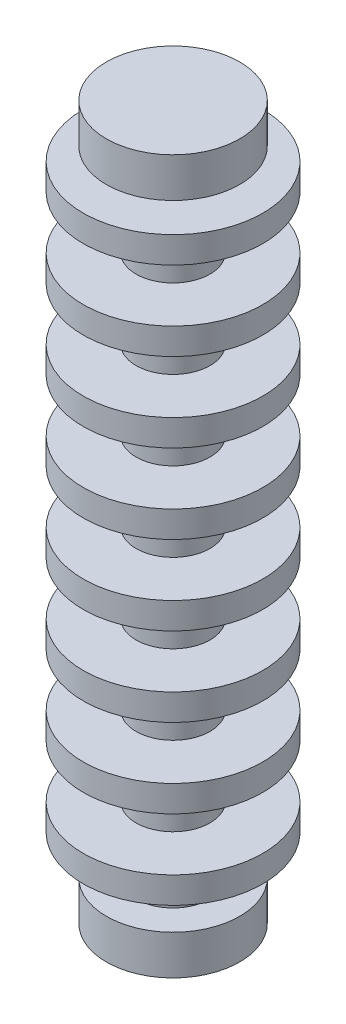
ISO-10303-21;
HEADER;
FILE_DESCRIPTION(('STEP AP214'),'2;1');
FILE_NAME('part.step','',(''),(''),'','','');
FILE_SCHEMA(('AUTOMOTIVE_DESIGN { 1 0 10303 214 1 1 1 1 }'));
ENDSEC;
DATA;
#1=APPLICATION_CONTEXT('core data for automotive mechanical design processes');
#2=APPLICATION_PROTOCOL_DEFINITION('international standard','automotive_design',2000,#1);
#3=PRODUCT_CONTEXT('',#1,'mechanical');
#4=PRODUCT('Part','Part','',(#3));
#5=PRODUCT_RELATED_PRODUCT_CATEGORY('part','',(#4));
#6=PRODUCT_DEFINITION_FORMATION('','',#4);
#7=PRODUCT_DEFINITION_CONTEXT('part definition',#1,'design');
#8=PRODUCT_DEFINITION('design','',#6,#7);
#9=PRODUCT_DEFINITION_SHAPE('','',#8);
#10=(LENGTH_UNIT() NAMED_UNIT(*) SI_UNIT(.MILLI.,.METRE.));
#11=(NAMED_UNIT(*) PLANE_ANGLE_UNIT() SI_UNIT($,.RADIAN.));
#12=(NAMED_UNIT(*) SI_UNIT($,.STERADIAN.) SOLID_ANGLE_UNIT());
#13=UNCERTAINTY_MEASURE_WITH_UNIT(LENGTH_MEASURE(1.E-05),#10,'distance_accuracy_value','');
#14=(GEOMETRIC_REPRESENTATION_CONTEXT(3) GLOBAL_UNCERTAINTY_ASSIGNED_CONTEXT((#13)) GLOBAL_UNIT_ASSIGNED_CONTEXT((#10,
#11,#12)) REPRESENTATION_CONTEXT('',''));
#15=CARTESIAN_POINT('',(0.,0.,0.));
#16=DIRECTION('',(0.,0.,1.));
#17=DIRECTION('',(1.,0.,0.));
#18=AXIS2_PLACEMENT_3D('',#15,#16,#17);
#19=CARTESIAN_POINT('',(5.04999999999947,27.,0.));
#20=DIRECTION('',(0.,-1.,0.));
#21=DIRECTION('',(1.,0.,0.));
#22=AXIS2_PLACEMENT_3D('',#19,#20,#21);
#23=PLANE('',#22);
#24=CARTESIAN_POINT('',(0.,27.,0.));
#25=DIRECTION('',(0.,1.,0.));
#26=DIRECTION('',(-1.,0.,0.));
#27=AXIS2_PLACEMENT_3D('',#24,#25,#26);
#28=CIRCLE('',#27,5.04999999999947);
#29=CARTESIAN_POINT('',(-5.04999999999947,27.,0.));
#30=VERTEX_POINT('',#29);
#31=EDGE_CURVE('E159',#30,#30,#28,.T.);
#32=ORIENTED_EDGE('',*,*,#31,.T.);
#33=EDGE_LOOP('',(#32));
#34=FACE_BOUND('',#33,.T.);
#35=ADVANCED_FACE('F41',(#34),#23,.F.);
#36=CARTESIAN_POINT('',(5.04999999999947,-27.,0.));
#37=DIRECTION('',(0.,1.,0.));
#38=DIRECTION('',(-1.,0.,0.));
#39=AXIS2_PLACEMENT_3D('',#36,#37,#38);
#40=PLANE('',#39);
#41=CARTESIAN_POINT('',(0.,-27.,0.));
#42=DIRECTION('',(0.,1.,0.));
#43=DIRECTION('',(-1.,0.,0.));
#44=AXIS2_PLACEMENT_3D('',#41,#42,#43);
#45=CIRCLE('',#44,5.04999999999947);
#46=CARTESIAN_POINT('',(-5.04999999999947,-27.,0.));
#47=VERTEX_POINT('',#46);
#48=EDGE_CURVE('E10',#47,#47,#45,.T.);
#49=ORIENTED_EDGE('',*,*,#48,.F.);
#50=EDGE_LOOP('',(#49));
#51=FACE_BOUND('',#50,.T.);
#52=ADVANCED_FACE('F381',(#51),#40,.F.);
#53=CARTESIAN_POINT('',(0.,27.,0.));
#54=DIRECTION('',(0.,1.,0.));
#55=DIRECTION('',(-1.,0.,0.));
#56=AXIS2_PLACEMENT_3D('',#53,#54,#55);
#57=CYLINDRICAL_SURFACE('',#56,5.04999999999947);
#58=CARTESIAN_POINT('',(0.,-24.,0.));
#59=DIRECTION('',(0.,1.,0.));
#60=DIRECTION('',(-1.,0.,0.));
#61=AXIS2_PLACEMENT_3D('',#58,#59,#60);
#62=CIRCLE('',#61,5.04999999999947);
#63=CARTESIAN_POINT('',(-5.04999999999947,-24.,0.));
#64=VERTEX_POINT('',#63);
#65=EDGE_CURVE('E47',#64,#64,#62,.T.);
#66=ORIENTED_EDGE('',*,*,#65,.F.);
#67=EDGE_LOOP('',(#66));
#68=FACE_BOUND('',#67,.T.);
#69=ORIENTED_EDGE('',*,*,#48,.T.);
#70=EDGE_LOOP('',(#69));
#71=FACE_BOUND('',#70,.T.);
#72=ADVANCED_FACE('F376',(#68,#71),#57,.T.);
#73=CARTESIAN_POINT('',(2.8,-24.,0.));
#74=DIRECTION('',(0.,-1.,0.));
#75=DIRECTION('',(1.,0.,0.));
#76=AXIS2_PLACEMENT_3D('',#73,#74,#75);
#77=PLANE('',#76);
#78=CARTESIAN_POINT('',(0.,-24.,0.));
#79=DIRECTION('',(0.,1.,0.));
#80=DIRECTION('',(-1.,0.,0.));
#81=AXIS2_PLACEMENT_3D('',#78,#79,#80);
#82=CIRCLE('',#81,2.8);
#83=CARTESIAN_POINT('',(-2.8,-24.,0.));
#84=VERTEX_POINT('',#83);
#85=EDGE_CURVE('E51',#84,#84,#82,.T.);
#86=ORIENTED_EDGE('',*,*,#85,.F.);
#87=EDGE_LOOP('',(#86));
#88=FACE_BOUND('',#87,.T.);
#89=ORIENTED_EDGE('',*,*,#65,.T.);
#90=EDGE_LOOP('',(#89));
#91=FACE_BOUND('',#90,.T.);
#92=ADVANCED_FACE('F371',(#88,#91),#77,.F.);
#93=CARTESIAN_POINT('',(0.,27.,0.));
#94=DIRECTION('',(0.,1.,0.));
#95=DIRECTION('',(-1.,0.,0.));
#96=AXIS2_PLACEMENT_3D('',#93,#94,#95);
#97=CYLINDRICAL_SURFACE('',#96,2.80000000000022);
#98=CARTESIAN_POINT('',(0.,-21.,0.));
#99=DIRECTION('',(0.,1.,0.));
#100=DIRECTION('',(-1.,0.,0.));
#101=AXIS2_PLACEMENT_3D('',#98,#99,#100);
#102=CIRCLE('',#101,2.80000000000043);
#103=CARTESIAN_POINT('',(-2.80000000000043,-21.,0.));
#104=VERTEX_POINT('',#103);
#105=EDGE_CURVE('E55',#104,#104,#102,.T.);
#106=ORIENTED_EDGE('',*,*,#105,.F.);
#107=EDGE_LOOP('',(#106));
#108=FACE_BOUND('',#107,.T.);
#109=ORIENTED_EDGE('',*,*,#85,.T.);
#110=EDGE_LOOP('',(#109));
#111=FACE_BOUND('',#110,.T.);
#112=ADVANCED_FACE('F365',(#108,#111),#97,.T.);
#113=CARTESIAN_POINT('',(6.80000000000044,-21.,0.));
#114=DIRECTION('',(0.,1.,0.));
#115=DIRECTION('',(-1.,0.,0.));
#116=AXIS2_PLACEMENT_3D('',#113,#114,#115);
#117=PLANE('',#116);
#118=CARTESIAN_POINT('',(0.,-21.,0.));
#119=DIRECTION('',(0.,1.,0.));
#120=DIRECTION('',(-1.,0.,0.));
#121=AXIS2_PLACEMENT_3D('',#118,#119,#120);
#122=CIRCLE('',#121,6.80000000000044);
#123=CARTESIAN_POINT('',(-6.80000000000044,-21.,0.));
#124=VERTEX_POINT('',#123);
#125=EDGE_CURVE('E60',#124,#124,#122,.T.);
#126=ORIENTED_EDGE('',*,*,#125,.F.);
#127=EDGE_LOOP('',(#126));
#128=FACE_BOUND('',#127,.T.);
#129=ORIENTED_EDGE('',*,*,#105,.T.);
#130=EDGE_LOOP('',(#129));
#131=FACE_BOUND('',#130,.T.);
#132=ADVANCED_FACE('F359',(#128,#131),#117,.F.);
#133=CARTESIAN_POINT('',(0.,27.,0.));
#134=DIRECTION('',(0.,1.,0.));
#135=DIRECTION('',(-1.,0.,0.));
#136=AXIS2_PLACEMENT_3D('',#133,#134,#135);
#137=CYLINDRICAL_SURFACE('',#136,6.80000000000044);
#138=CARTESIAN_POINT('',(0.,-19.,0.));
#139=DIRECTION('',(0.,1.,0.));
#140=DIRECTION('',(-1.,0.,0.));
#141=AXIS2_PLACEMENT_3D('',#138,#139,#140);
#142=CIRCLE('',#141,6.80000000000044);
#143=CARTESIAN_POINT('',(-6.80000000000043,-19.,0.));
#144=VERTEX_POINT('',#143);
#145=EDGE_CURVE('E63',#144,#144,#142,.T.);
#146=ORIENTED_EDGE('',*,*,#145,.F.);
#147=EDGE_LOOP('',(#146));
#148=FACE_BOUND('',#147,.T.);
#149=ORIENTED_EDGE('',*,*,#125,.T.);
#150=EDGE_LOOP('',(#149));
#151=FACE_BOUND('',#150,.T.);
#152=ADVANCED_FACE('F353',(#148,#151),#137,.T.);
#153=CARTESIAN_POINT('',(2.80000000000044,-19.,0.));
#154=DIRECTION('',(0.,-1.,0.));
#155=DIRECTION('',(1.,0.,0.));
#156=AXIS2_PLACEMENT_3D('',#153,#154,#155);
#157=PLANE('',#156);
#158=CARTESIAN_POINT('',(0.,-19.,0.));
#159=DIRECTION('',(0.,1.,0.));
#160=DIRECTION('',(-1.,0.,0.));
#161=AXIS2_PLACEMENT_3D('',#158,#159,#160);
#162=CIRCLE('',#161,2.80000000000043);
#163=CARTESIAN_POINT('',(-2.80000000000043,-19.,0.));
#164=VERTEX_POINT('',#163);
#165=EDGE_CURVE('E66',#164,#164,#162,.T.);
#166=ORIENTED_EDGE('',*,*,#165,.F.);
#167=EDGE_LOOP('',(#166));
#168=FACE_BOUND('',#167,.T.);
#169=ORIENTED_EDGE('',*,*,#145,.T.);
#170=EDGE_LOOP('',(#169));
#171=FACE_BOUND('',#170,.T.);
#172=ADVANCED_FACE('F347',(#168,#171),#157,.F.);
#173=CARTESIAN_POINT('',(0.,27.,0.));
#174=DIRECTION('',(0.,1.,0.));
#175=DIRECTION('',(-1.,0.,0.));
#176=AXIS2_PLACEMENT_3D('',#173,#174,#175);
#177=CYLINDRICAL_SURFACE('',#176,2.8000000000004);
#178=CARTESIAN_POINT('',(0.,-15.,0.));
#179=DIRECTION('',(0.,1.,0.));
#180=DIRECTION('',(-1.,0.,0.));
#181=AXIS2_PLACEMENT_3D('',#178,#179,#180);
#182=CIRCLE('',#181,2.80000000000037);
#183=CARTESIAN_POINT('',(-2.80000000000037,-15.,0.));
#184=VERTEX_POINT('',#183);
#185=EDGE_CURVE('E69',#184,#184,#182,.T.);
#186=ORIENTED_EDGE('',*,*,#185,.F.);
#187=EDGE_LOOP('',(#186));
#188=FACE_BOUND('',#187,.T.);
#189=ORIENTED_EDGE('',*,*,#165,.T.);
#190=EDGE_LOOP('',(#189));
#191=FACE_BOUND('',#190,.T.);
#192=ADVANCED_FACE('F341',(#188,#191),#177,.T.);
#193=CARTESIAN_POINT('',(6.80000000000038,-15.,0.));
#194=DIRECTION('',(0.,1.,0.));
#195=DIRECTION('',(-1.,0.,0.));
#196=AXIS2_PLACEMENT_3D('',#193,#194,#195);
#197=PLANE('',#196);
#198=CARTESIAN_POINT('',(0.,-15.,0.));
#199=DIRECTION('',(0.,1.,0.));
#200=DIRECTION('',(-1.,0.,0.));
#201=AXIS2_PLACEMENT_3D('',#198,#199,#200);
#202=CIRCLE('',#201,6.80000000000038);
#203=CARTESIAN_POINT('',(-6.80000000000037,-15.,0.));
#204=VERTEX_POINT('',#203);
#205=EDGE_CURVE('E72',#204,#204,#202,.T.);
#206=ORIENTED_EDGE('',*,*,#205,.F.);
#207=EDGE_LOOP('',(#206));
#208=FACE_BOUND('',#207,.T.);
#209=ORIENTED_EDGE('',*,*,#185,.T.);
#210=EDGE_LOOP('',(#209));
#211=FACE_BOUND('',#210,.T.);
#212=ADVANCED_FACE('F335',(#208,#211),#197,.F.);
#213=CARTESIAN_POINT('',(0.,27.,0.));
#214=DIRECTION('',(0.,1.,0.));
#215=DIRECTION('',(-1.,0.,0.));
#216=AXIS2_PLACEMENT_3D('',#213,#214,#215);
#217=CYLINDRICAL_SURFACE('',#216,6.80000000000038);
#218=CARTESIAN_POINT('',(0.,-13.,0.));
#219=DIRECTION('',(0.,1.,0.));
#220=DIRECTION('',(-1.,0.,0.));
#221=AXIS2_PLACEMENT_3D('',#218,#219,#220);
#222=CIRCLE('',#221,6.80000000000037);
#223=CARTESIAN_POINT('',(-6.80000000000037,-13.,0.));
#224=VERTEX_POINT('',#223);
#225=EDGE_CURVE('E75',#224,#224,#222,.T.);
#226=ORIENTED_EDGE('',*,*,#225,.F.);
#227=EDGE_LOOP('',(#226));
#228=FACE_BOUND('',#227,.T.);
#229=ORIENTED_EDGE('',*,*,#205,.T.);
#230=EDGE_LOOP('',(#229));
#231=FACE_BOUND('',#230,.T.);
#232=ADVANCED_FACE('F329',(#228,#231),#217,.T.);
#233=CARTESIAN_POINT('',(2.80000000000037,-13.,0.));
#234=DIRECTION('',(0.,-1.,0.));
#235=DIRECTION('',(1.,0.,0.));
#236=AXIS2_PLACEMENT_3D('',#233,#234,#235);
#237=PLANE('',#236);
#238=CARTESIAN_POINT('',(0.,-13.,0.));
#239=DIRECTION('',(0.,1.,0.));
#240=DIRECTION('',(-1.,0.,0.));
#241=AXIS2_PLACEMENT_3D('',#238,#239,#240);
#242=CIRCLE('',#241,2.80000000000037);
#243=CARTESIAN_POINT('',(-2.80000000000037,-13.,0.));
#244=VERTEX_POINT('',#243);
#245=EDGE_CURVE('E78',#244,#244,#242,.T.);
#246=ORIENTED_EDGE('',*,*,#245,.F.);
#247=EDGE_LOOP('',(#246));
#248=FACE_BOUND('',#247,.T.);
#249=ORIENTED_EDGE('',*,*,#225,.T.);
#250=EDGE_LOOP('',(#249));
#251=FACE_BOUND('',#250,.T.);
#252=ADVANCED_FACE('F323',(#248,#251),#237,.F.);
#253=CARTESIAN_POINT('',(0.,27.,0.));
#254=DIRECTION('',(0.,1.,0.));
#255=DIRECTION('',(-1.,0.,0.));
#256=AXIS2_PLACEMENT_3D('',#253,#254,#255);
#257=CYLINDRICAL_SURFACE('',#256,2.80000000000034);
#258=CARTESIAN_POINT('',(0.,-9.,0.));
#259=DIRECTION('',(0.,1.,0.));
#260=DIRECTION('',(-1.,0.,0.));
#261=AXIS2_PLACEMENT_3D('',#258,#259,#260);
#262=CIRCLE('',#261,2.80000000000031);
#263=CARTESIAN_POINT('',(-2.80000000000031,-9.,0.));
#264=VERTEX_POINT('',#263);
#265=EDGE_CURVE('E81',#264,#264,#262,.T.);
#266=ORIENTED_EDGE('',*,*,#265,.F.);
#267=EDGE_LOOP('',(#266));
#268=FACE_BOUND('',#267,.T.);
#269=ORIENTED_EDGE('',*,*,#245,.T.);
#270=EDGE_LOOP('',(#269));
#271=FACE_BOUND('',#270,.T.);
#272=ADVANCED_FACE('F317',(#268,#271),#257,.T.);
#273=CARTESIAN_POINT('',(6.80000000000032,-9.,0.));
#274=DIRECTION('',(0.,1.,0.));
#275=DIRECTION('',(-1.,0.,0.));
#276=AXIS2_PLACEMENT_3D('',#273,#274,#275);
#277=PLANE('',#276);
#278=CARTESIAN_POINT('',(0.,-9.,0.));
#279=DIRECTION('',(0.,1.,0.));
#280=DIRECTION('',(-1.,0.,0.));
#281=AXIS2_PLACEMENT_3D('',#278,#279,#280);
#282=CIRCLE('',#281,6.80000000000031);
#283=CARTESIAN_POINT('',(-6.80000000000031,-9.,0.));
#284=VERTEX_POINT('',#283);
#285=EDGE_CURVE('E84',#284,#284,#282,.T.);
#286=ORIENTED_EDGE('',*,*,#285,.F.);
#287=EDGE_LOOP('',(#286));
#288=FACE_BOUND('',#287,.T.);
#289=ORIENTED_EDGE('',*,*,#265,.T.);
#290=EDGE_LOOP('',(#289));
#291=FACE_BOUND('',#290,.T.);
#292=ADVANCED_FACE('F311',(#288,#291),#277,.F.);
#293=CARTESIAN_POINT('',(0.,27.,0.));
#294=DIRECTION('',(0.,1.,0.));
#295=DIRECTION('',(-1.,0.,0.));
#296=AXIS2_PLACEMENT_3D('',#293,#294,#295);
#297=CYLINDRICAL_SURFACE('',#296,6.80000000000031);
#298=CARTESIAN_POINT('',(0.,-7.,0.));
#299=DIRECTION('',(0.,1.,0.));
#300=DIRECTION('',(-1.,0.,0.));
#301=AXIS2_PLACEMENT_3D('',#298,#299,#300);
#302=CIRCLE('',#301,6.80000000000031);
#303=CARTESIAN_POINT('',(-6.80000000000031,-7.,0.));
#304=VERTEX_POINT('',#303);
#305=EDGE_CURVE('E87',#304,#304,#302,.T.);
#306=ORIENTED_EDGE('',*,*,#305,.F.);
#307=EDGE_LOOP('',(#306));
#308=FACE_BOUND('',#307,.T.);
#309=ORIENTED_EDGE('',*,*,#285,.T.);
#310=EDGE_LOOP('',(#309));
#311=FACE_BOUND('',#310,.T.);
#312=ADVANCED_FACE('F305',(#308,#311),#297,.T.);
#313=CARTESIAN_POINT('',(2.80000000000031,-7.,0.));
#314=DIRECTION('',(0.,-1.,0.));
#315=DIRECTION('',(1.,0.,0.));
#316=AXIS2_PLACEMENT_3D('',#313,#314,#315);
#317=PLANE('',#316);
#318=CARTESIAN_POINT('',(0.,-7.,0.));
#319=DIRECTION('',(0.,1.,0.));
#320=DIRECTION('',(-1.,0.,0.));
#321=AXIS2_PLACEMENT_3D('',#318,#319,#320);
#322=CIRCLE('',#321,2.80000000000031);
#323=CARTESIAN_POINT('',(-2.80000000000031,-7.,0.));
#324=VERTEX_POINT('',#323);
#325=EDGE_CURVE('E90',#324,#324,#322,.T.);
#326=ORIENTED_EDGE('',*,*,#325,.F.);
#327=EDGE_LOOP('',(#326));
#328=FACE_BOUND('',#327,.T.);
#329=ORIENTED_EDGE('',*,*,#305,.T.);
#330=EDGE_LOOP('',(#329));
#331=FACE_BOUND('',#330,.T.);
#332=ADVANCED_FACE('F299',(#328,#331),#317,.F.);
#333=CARTESIAN_POINT('',(0.,27.,0.));
#334=DIRECTION('',(0.,1.,0.));
#335=DIRECTION('',(-1.,0.,0.));
#336=AXIS2_PLACEMENT_3D('',#333,#334,#335);
#337=CYLINDRICAL_SURFACE('',#336,2.80000000000028);
#338=CARTESIAN_POINT('',(0.,-3.,0.));
#339=DIRECTION('',(0.,1.,0.));
#340=DIRECTION('',(-1.,0.,0.));
#341=AXIS2_PLACEMENT_3D('',#338,#339,#340);
#342=CIRCLE('',#341,2.80000000000025);
#343=CARTESIAN_POINT('',(-2.80000000000025,-3.,0.));
#344=VERTEX_POINT('',#343);
#345=EDGE_CURVE('E93',#344,#344,#342,.T.);
#346=ORIENTED_EDGE('',*,*,#345,.F.);
#347=EDGE_LOOP('',(#346));
#348=FACE_BOUND('',#347,.T.);
#349=ORIENTED_EDGE('',*,*,#325,.T.);
#350=EDGE_LOOP('',(#349));
#351=FACE_BOUND('',#350,.T.);
#352=ADVANCED_FACE('F293',(#348,#351),#337,.T.);
#353=CARTESIAN_POINT('',(6.80000000000025,-3.,0.));
#354=DIRECTION('',(0.,1.,0.));
#355=DIRECTION('',(-1.,0.,0.));
#356=AXIS2_PLACEMENT_3D('',#353,#354,#355);
#357=PLANE('',#356);
#358=CARTESIAN_POINT('',(0.,-3.,0.));
#359=DIRECTION('',(0.,1.,0.));
#360=DIRECTION('',(-1.,0.,0.));
#361=AXIS2_PLACEMENT_3D('',#358,#359,#360);
#362=CIRCLE('',#361,6.80000000000025);
#363=CARTESIAN_POINT('',(-6.80000000000025,-3.,0.));
#364=VERTEX_POINT('',#363);
#365=EDGE_CURVE('E96',#364,#364,#362,.T.);
#366=ORIENTED_EDGE('',*,*,#365,.F.);
#367=EDGE_LOOP('',(#366));
#368=FACE_BOUND('',#367,.T.);
#369=ORIENTED_EDGE('',*,*,#345,.T.);
#370=EDGE_LOOP('',(#369));
#371=FACE_BOUND('',#370,.T.);
#372=ADVANCED_FACE('F287',(#368,#371),#357,.F.);
#373=CARTESIAN_POINT('',(0.,27.,0.));
#374=DIRECTION('',(0.,1.,0.));
#375=DIRECTION('',(-1.,0.,0.));
#376=AXIS2_PLACEMENT_3D('',#373,#374,#375);
#377=CYLINDRICAL_SURFACE('',#376,6.80000000000025);
#378=CARTESIAN_POINT('',(0.,-1.,0.));
#379=DIRECTION('',(0.,1.,0.));
#380=DIRECTION('',(-1.,0.,0.));
#381=AXIS2_PLACEMENT_3D('',#378,#379,#380);
#382=CIRCLE('',#381,6.80000000000025);
#383=CARTESIAN_POINT('',(-6.80000000000025,-1.,0.));
#384=VERTEX_POINT('',#383);
#385=EDGE_CURVE('E99',#384,#384,#382,.T.);
#386=ORIENTED_EDGE('',*,*,#385,.F.);
#387=EDGE_LOOP('',(#386));
#388=FACE_BOUND('',#387,.T.);
#389=ORIENTED_EDGE('',*,*,#365,.T.);
#390=EDGE_LOOP('',(#389));
#391=FACE_BOUND('',#390,.T.);
#392=ADVANCED_FACE('F281',(#388,#391),#377,.T.);
#393=CARTESIAN_POINT('',(2.80000000000025,-1.,0.));
#394=DIRECTION('',(0.,-1.,0.));
#395=DIRECTION('',(1.,0.,0.));
#396=AXIS2_PLACEMENT_3D('',#393,#394,#395);
#397=PLANE('',#396);
#398=CARTESIAN_POINT('',(0.,-1.,0.));
#399=DIRECTION('',(0.,1.,0.));
#400=DIRECTION('',(-1.,0.,0.));
#401=AXIS2_PLACEMENT_3D('',#398,#399,#400);
#402=CIRCLE('',#401,2.80000000000025);
#403=CARTESIAN_POINT('',(-2.80000000000025,-1.,0.));
#404=VERTEX_POINT('',#403);
#405=EDGE_CURVE('E102',#404,#404,#402,.T.);
#406=ORIENTED_EDGE('',*,*,#405,.F.);
#407=EDGE_LOOP('',(#406));
#408=FACE_BOUND('',#407,.T.);
#409=ORIENTED_EDGE('',*,*,#385,.T.);
#410=EDGE_LOOP('',(#409));
#411=FACE_BOUND('',#410,.T.);
#412=ADVANCED_FACE('F275',(#408,#411),#397,.F.);
#413=CARTESIAN_POINT('',(0.,27.,0.));
#414=DIRECTION('',(0.,1.,0.));
#415=DIRECTION('',(-1.,0.,0.));
#416=AXIS2_PLACEMENT_3D('',#413,#414,#415);
#417=CYLINDRICAL_SURFACE('',#416,2.80000000000022);
#418=CARTESIAN_POINT('',(0.,3.,0.));
#419=DIRECTION('',(0.,1.,0.));
#420=DIRECTION('',(-1.,0.,0.));
#421=AXIS2_PLACEMENT_3D('',#418,#419,#420);
#422=CIRCLE('',#421,2.80000000000019);
#423=CARTESIAN_POINT('',(-2.80000000000018,3.,0.));
#424=VERTEX_POINT('',#423);
#425=EDGE_CURVE('E105',#424,#424,#422,.T.);
#426=ORIENTED_EDGE('',*,*,#425,.F.);
#427=EDGE_LOOP('',(#426));
#428=FACE_BOUND('',#427,.T.);
#429=ORIENTED_EDGE('',*,*,#405,.T.);
#430=EDGE_LOOP('',(#429));
#431=FACE_BOUND('',#430,.T.);
#432=ADVANCED_FACE('F269',(#428,#431),#417,.T.);
#433=CARTESIAN_POINT('',(6.80000000000019,3.,0.));
#434=DIRECTION('',(0.,1.,0.));
#435=DIRECTION('',(-1.,0.,0.));
#436=AXIS2_PLACEMENT_3D('',#433,#434,#435);
#437=PLANE('',#436);
#438=CARTESIAN_POINT('',(0.,3.,0.));
#439=DIRECTION('',(0.,1.,0.));
#440=DIRECTION('',(-1.,0.,0.));
#441=AXIS2_PLACEMENT_3D('',#438,#439,#440);
#442=CIRCLE('',#441,6.80000000000019);
#443=CARTESIAN_POINT('',(-6.80000000000019,3.,0.));
#444=VERTEX_POINT('',#443);
#445=EDGE_CURVE('E108',#444,#444,#442,.T.);
#446=ORIENTED_EDGE('',*,*,#445,.F.);
#447=EDGE_LOOP('',(#446));
#448=FACE_BOUND('',#447,.T.);
#449=ORIENTED_EDGE('',*,*,#425,.T.);
#450=EDGE_LOOP('',(#449));
#451=FACE_BOUND('',#450,.T.);
#452=ADVANCED_FACE('F263',(#448,#451),#437,.F.);
#453=CARTESIAN_POINT('',(0.,27.,0.));
#454=DIRECTION('',(0.,1.,0.));
#455=DIRECTION('',(-1.,0.,0.));
#456=AXIS2_PLACEMENT_3D('',#453,#454,#455);
#457=CYLINDRICAL_SURFACE('',#456,6.80000000000019);
#458=CARTESIAN_POINT('',(0.,5.,0.));
#459=DIRECTION('',(0.,1.,0.));
#460=DIRECTION('',(-1.,0.,0.));
#461=AXIS2_PLACEMENT_3D('',#458,#459,#460);
#462=CIRCLE('',#461,6.80000000000019);
#463=CARTESIAN_POINT('',(-6.80000000000019,5.,0.));
#464=VERTEX_POINT('',#463);
#465=EDGE_CURVE('E111',#464,#464,#462,.T.);
#466=ORIENTED_EDGE('',*,*,#465,.F.);
#467=EDGE_LOOP('',(#466));
#468=FACE_BOUND('',#467,.T.);
#469=ORIENTED_EDGE('',*,*,#445,.T.);
#470=EDGE_LOOP('',(#469));
#471=FACE_BOUND('',#470,.T.);
#472=ADVANCED_FACE('F257',(#468,#471),#457,.T.);
#473=CARTESIAN_POINT('',(2.80000000000019,5.,0.));
#474=DIRECTION('',(0.,-1.,0.));
#475=DIRECTION('',(1.,0.,0.));
#476=AXIS2_PLACEMENT_3D('',#473,#474,#475);
#477=PLANE('',#476);
#478=CARTESIAN_POINT('',(0.,5.,0.));
#479=DIRECTION('',(0.,1.,0.));
#480=DIRECTION('',(-1.,0.,0.));
#481=AXIS2_PLACEMENT_3D('',#478,#479,#480);
#482=CIRCLE('',#481,2.80000000000019);
#483=CARTESIAN_POINT('',(-2.80000000000018,5.,0.));
#484=VERTEX_POINT('',#483);
#485=EDGE_CURVE('E114',#484,#484,#482,.T.);
#486=ORIENTED_EDGE('',*,*,#485,.F.);
#487=EDGE_LOOP('',(#486));
#488=FACE_BOUND('',#487,.T.);
#489=ORIENTED_EDGE('',*,*,#465,.T.);
#490=EDGE_LOOP('',(#489));
#491=FACE_BOUND('',#490,.T.);
#492=ADVANCED_FACE('F251',(#488,#491),#477,.F.);
#493=CARTESIAN_POINT('',(0.,27.,0.));
#494=DIRECTION('',(0.,1.,0.));
#495=DIRECTION('',(-1.,0.,0.));
#496=AXIS2_PLACEMENT_3D('',#493,#494,#495);
#497=CYLINDRICAL_SURFACE('',#496,2.80000000000015);
#498=CARTESIAN_POINT('',(0.,8.99999999999999,0.));
#499=DIRECTION('',(0.,1.,0.));
#500=DIRECTION('',(-1.,0.,0.));
#501=AXIS2_PLACEMENT_3D('',#498,#499,#500);
#502=CIRCLE('',#501,2.80000000000012);
#503=CARTESIAN_POINT('',(-2.80000000000012,8.99999999999999,0.));
#504=VERTEX_POINT('',#503);
#505=EDGE_CURVE('E117',#504,#504,#502,.T.);
#506=ORIENTED_EDGE('',*,*,#505,.F.);
#507=EDGE_LOOP('',(#506));
#508=FACE_BOUND('',#507,.T.);
#509=ORIENTED_EDGE('',*,*,#485,.T.);
#510=EDGE_LOOP('',(#509));
#511=FACE_BOUND('',#510,.T.);
#512=ADVANCED_FACE('F245',(#508,#511),#497,.T.);
#513=CARTESIAN_POINT('',(6.80000000000013,9.,0.));
#514=DIRECTION('',(0.,1.,0.));
#515=DIRECTION('',(-1.,0.,0.));
#516=AXIS2_PLACEMENT_3D('',#513,#514,#515);
#517=PLANE('',#516);
#518=CARTESIAN_POINT('',(0.,9.,0.));
#519=DIRECTION('',(0.,1.,0.));
#520=DIRECTION('',(-1.,0.,0.));
#521=AXIS2_PLACEMENT_3D('',#518,#519,#520);
#522=CIRCLE('',#521,6.80000000000013);
#523=CARTESIAN_POINT('',(-6.80000000000013,9.,0.));
#524=VERTEX_POINT('',#523);
#525=EDGE_CURVE('E120',#524,#524,#522,.T.);
#526=ORIENTED_EDGE('',*,*,#525,.F.);
#527=EDGE_LOOP('',(#526));
#528=FACE_BOUND('',#527,.T.);
#529=ORIENTED_EDGE('',*,*,#505,.T.);
#530=EDGE_LOOP('',(#529));
#531=FACE_BOUND('',#530,.T.);
#532=ADVANCED_FACE('F239',(#528,#531),#517,.F.);
#533=CARTESIAN_POINT('',(0.,27.,0.));
#534=DIRECTION('',(0.,1.,0.));
#535=DIRECTION('',(-1.,0.,0.));
#536=AXIS2_PLACEMENT_3D('',#533,#534,#535);
#537=CYLINDRICAL_SURFACE('',#536,6.80000000000013);
#538=CARTESIAN_POINT('',(0.,11.,0.));
#539=DIRECTION('',(0.,1.,0.));
#540=DIRECTION('',(-1.,0.,0.));
#541=AXIS2_PLACEMENT_3D('',#538,#539,#540);
#542=CIRCLE('',#541,6.80000000000013);
#543=CARTESIAN_POINT('',(-6.80000000000013,11.,0.));
#544=VERTEX_POINT('',#543);
#545=EDGE_CURVE('E123',#544,#544,#542,.T.);
#546=ORIENTED_EDGE('',*,*,#545,.F.);
#547=EDGE_LOOP('',(#546));
#548=FACE_BOUND('',#547,.T.);
#549=ORIENTED_EDGE('',*,*,#525,.T.);
#550=EDGE_LOOP('',(#549));
#551=FACE_BOUND('',#550,.T.);
#552=ADVANCED_FACE('F233',(#548,#551),#537,.T.);
#553=CARTESIAN_POINT('',(2.80000000000012,11.,0.));
#554=DIRECTION('',(0.,-1.,0.));
#555=DIRECTION('',(1.,0.,0.));
#556=AXIS2_PLACEMENT_3D('',#553,#554,#555);
#557=PLANE('',#556);
#558=CARTESIAN_POINT('',(0.,11.,0.));
#559=DIRECTION('',(0.,1.,0.));
#560=DIRECTION('',(-1.,0.,0.));
#561=AXIS2_PLACEMENT_3D('',#558,#559,#560);
#562=CIRCLE('',#561,2.80000000000012);
#563=CARTESIAN_POINT('',(-2.80000000000012,11.,0.));
#564=VERTEX_POINT('',#563);
#565=EDGE_CURVE('E126',#564,#564,#562,.T.);
#566=ORIENTED_EDGE('',*,*,#565,.F.);
#567=EDGE_LOOP('',(#566));
#568=FACE_BOUND('',#567,.T.);
#569=ORIENTED_EDGE('',*,*,#545,.T.);
#570=EDGE_LOOP('',(#569));
#571=FACE_BOUND('',#570,.T.);
#572=ADVANCED_FACE('F227',(#568,#571),#557,.F.);
#573=CARTESIAN_POINT('',(0.,27.,0.));
#574=DIRECTION('',(0.,1.,0.));
#575=DIRECTION('',(-1.,0.,0.));
#576=AXIS2_PLACEMENT_3D('',#573,#574,#575);
#577=CYLINDRICAL_SURFACE('',#576,2.80000000000009);
#578=CARTESIAN_POINT('',(0.,15.,0.));
#579=DIRECTION('',(0.,1.,0.));
#580=DIRECTION('',(-1.,0.,0.));
#581=AXIS2_PLACEMENT_3D('',#578,#579,#580);
#582=CIRCLE('',#581,2.80000000000006);
#583=CARTESIAN_POINT('',(-2.80000000000006,15.,0.));
#584=VERTEX_POINT('',#583);
#585=EDGE_CURVE('E129',#584,#584,#582,.T.);
#586=ORIENTED_EDGE('',*,*,#585,.F.);
#587=EDGE_LOOP('',(#586));
#588=FACE_BOUND('',#587,.T.);
#589=ORIENTED_EDGE('',*,*,#565,.T.);
#590=EDGE_LOOP('',(#589));
#591=FACE_BOUND('',#590,.T.);
#592=ADVANCED_FACE('F221',(#588,#591),#577,.T.);
#593=CARTESIAN_POINT('',(6.80000000000007,15.,0.));
#594=DIRECTION('',(0.,1.,0.));
#595=DIRECTION('',(-1.,0.,0.));
#596=AXIS2_PLACEMENT_3D('',#593,#594,#595);
#597=PLANE('',#596);
#598=CARTESIAN_POINT('',(0.,15.,0.));
#599=DIRECTION('',(0.,1.,0.));
#600=DIRECTION('',(-1.,0.,0.));
#601=AXIS2_PLACEMENT_3D('',#598,#599,#600);
#602=CIRCLE('',#601,6.80000000000007);
#603=CARTESIAN_POINT('',(-6.80000000000006,15.,0.));
#604=VERTEX_POINT('',#603);
#605=EDGE_CURVE('E132',#604,#604,#602,.T.);
#606=ORIENTED_EDGE('',*,*,#605,.F.);
#607=EDGE_LOOP('',(#606));
#608=FACE_BOUND('',#607,.T.);
#609=ORIENTED_EDGE('',*,*,#585,.T.);
#610=EDGE_LOOP('',(#609));
#611=FACE_BOUND('',#610,.T.);
#612=ADVANCED_FACE('F215',(#608,#611),#597,.F.);
#613=CARTESIAN_POINT('',(0.,27.,0.));
#614=DIRECTION('',(0.,1.,0.));
#615=DIRECTION('',(-1.,0.,0.));
#616=AXIS2_PLACEMENT_3D('',#613,#614,#615);
#617=CYLINDRICAL_SURFACE('',#616,6.80000000000006);
#618=CARTESIAN_POINT('',(0.,17.,0.));
#619=DIRECTION('',(0.,1.,0.));
#620=DIRECTION('',(-1.,0.,0.));
#621=AXIS2_PLACEMENT_3D('',#618,#619,#620);
#622=CIRCLE('',#621,6.80000000000006);
#623=CARTESIAN_POINT('',(-6.80000000000006,17.,0.));
#624=VERTEX_POINT('',#623);
#625=EDGE_CURVE('E135',#624,#624,#622,.T.);
#626=ORIENTED_EDGE('',*,*,#625,.F.);
#627=EDGE_LOOP('',(#626));
#628=FACE_BOUND('',#627,.T.);
#629=ORIENTED_EDGE('',*,*,#605,.T.);
#630=EDGE_LOOP('',(#629));
#631=FACE_BOUND('',#630,.T.);
#632=ADVANCED_FACE('F209',(#628,#631),#617,.T.);
#633=CARTESIAN_POINT('',(2.80000000000006,17.,0.));
#634=DIRECTION('',(0.,-1.,0.));
#635=DIRECTION('',(1.,0.,0.));
#636=AXIS2_PLACEMENT_3D('',#633,#634,#635);
#637=PLANE('',#636);
#638=CARTESIAN_POINT('',(0.,17.,0.));
#639=DIRECTION('',(0.,1.,0.));
#640=DIRECTION('',(-1.,0.,0.));
#641=AXIS2_PLACEMENT_3D('',#638,#639,#640);
#642=CIRCLE('',#641,2.80000000000006);
#643=CARTESIAN_POINT('',(-2.80000000000006,17.,0.));
#644=VERTEX_POINT('',#643);
#645=EDGE_CURVE('E138',#644,#644,#642,.T.);
#646=ORIENTED_EDGE('',*,*,#645,.F.);
#647=EDGE_LOOP('',(#646));
#648=FACE_BOUND('',#647,.T.);
#649=ORIENTED_EDGE('',*,*,#625,.T.);
#650=EDGE_LOOP('',(#649));
#651=FACE_BOUND('',#650,.T.);
#652=ADVANCED_FACE('F203',(#648,#651),#637,.F.);
#653=CARTESIAN_POINT('',(0.,27.,0.));
#654=DIRECTION('',(0.,1.,0.));
#655=DIRECTION('',(-1.,0.,0.));
#656=AXIS2_PLACEMENT_3D('',#653,#654,#655);
#657=CYLINDRICAL_SURFACE('',#656,2.79999999999978);
#658=CARTESIAN_POINT('',(0.,21.,0.));
#659=DIRECTION('',(0.,1.,0.));
#660=DIRECTION('',(-1.,0.,0.));
#661=AXIS2_PLACEMENT_3D('',#658,#659,#660);
#662=CIRCLE('',#661,2.8);
#663=CARTESIAN_POINT('',(-2.8,21.,0.));
#664=VERTEX_POINT('',#663);
#665=EDGE_CURVE('E141',#664,#664,#662,.T.);
#666=ORIENTED_EDGE('',*,*,#665,.F.);
#667=EDGE_LOOP('',(#666));
#668=FACE_BOUND('',#667,.T.);
#669=ORIENTED_EDGE('',*,*,#645,.T.);
#670=EDGE_LOOP('',(#669));
#671=FACE_BOUND('',#670,.T.);
#672=ADVANCED_FACE('F197',(#668,#671),#657,.T.);
#673=CARTESIAN_POINT('',(6.8,21.,0.));
#674=DIRECTION('',(0.,1.,0.));
#675=DIRECTION('',(-1.,0.,0.));
#676=AXIS2_PLACEMENT_3D('',#673,#674,#675);
#677=PLANE('',#676);
#678=CARTESIAN_POINT('',(0.,21.,0.));
#679=DIRECTION('',(0.,1.,0.));
#680=DIRECTION('',(-1.,0.,0.));
#681=AXIS2_PLACEMENT_3D('',#678,#679,#680);
#682=CIRCLE('',#681,6.8);
#683=CARTESIAN_POINT('',(-6.8,21.,0.));
#684=VERTEX_POINT('',#683);
#685=EDGE_CURVE('E144',#684,#684,#682,.T.);
#686=ORIENTED_EDGE('',*,*,#685,.F.);
#687=EDGE_LOOP('',(#686));
#688=FACE_BOUND('',#687,.T.);
#689=ORIENTED_EDGE('',*,*,#665,.T.);
#690=EDGE_LOOP('',(#689));
#691=FACE_BOUND('',#690,.T.);
#692=ADVANCED_FACE('F191',(#688,#691),#677,.F.);
#693=CARTESIAN_POINT('',(0.,27.,0.));
#694=DIRECTION('',(0.,1.,0.));
#695=DIRECTION('',(-1.,0.,0.));
#696=AXIS2_PLACEMENT_3D('',#693,#694,#695);
#697=CYLINDRICAL_SURFACE('',#696,6.8);
#698=CARTESIAN_POINT('',(0.,23.,0.));
#699=DIRECTION('',(0.,1.,0.));
#700=DIRECTION('',(-1.,0.,0.));
#701=AXIS2_PLACEMENT_3D('',#698,#699,#700);
#702=CIRCLE('',#701,6.8);
#703=CARTESIAN_POINT('',(-6.8,23.,0.));
#704=VERTEX_POINT('',#703);
#705=EDGE_CURVE('E147',#704,#704,#702,.T.);
#706=ORIENTED_EDGE('',*,*,#705,.F.);
#707=EDGE_LOOP('',(#706));
#708=FACE_BOUND('',#707,.T.);
#709=ORIENTED_EDGE('',*,*,#685,.T.);
#710=EDGE_LOOP('',(#709));
#711=FACE_BOUND('',#710,.T.);
#712=ADVANCED_FACE('F185',(#708,#711),#697,.T.);
#713=CARTESIAN_POINT('',(2.8,23.,0.));
#714=DIRECTION('',(0.,-1.,0.));
#715=DIRECTION('',(1.,0.,0.));
#716=AXIS2_PLACEMENT_3D('',#713,#714,#715);
#717=PLANE('',#716);
#718=CARTESIAN_POINT('',(0.,23.,0.));
#719=DIRECTION('',(0.,1.,0.));
#720=DIRECTION('',(-1.,0.,0.));
#721=AXIS2_PLACEMENT_3D('',#718,#719,#720);
#722=CIRCLE('',#721,2.8);
#723=CARTESIAN_POINT('',(-2.8,23.,0.));
#724=VERTEX_POINT('',#723);
#725=EDGE_CURVE('E150',#724,#724,#722,.T.);
#726=ORIENTED_EDGE('',*,*,#725,.F.);
#727=EDGE_LOOP('',(#726));
#728=FACE_BOUND('',#727,.T.);
#729=ORIENTED_EDGE('',*,*,#705,.T.);
#730=EDGE_LOOP('',(#729));
#731=FACE_BOUND('',#730,.T.);
#732=ADVANCED_FACE('F179',(#728,#731),#717,.F.);
#733=CARTESIAN_POINT('',(0.,27.,0.));
#734=DIRECTION('',(0.,1.,0.));
#735=DIRECTION('',(-1.,0.,0.));
#736=AXIS2_PLACEMENT_3D('',#733,#734,#735);
#737=CYLINDRICAL_SURFACE('',#736,2.8);
#738=CARTESIAN_POINT('',(0.,24.,0.));
#739=DIRECTION('',(0.,1.,0.));
#740=DIRECTION('',(-1.,0.,0.));
#741=AXIS2_PLACEMENT_3D('',#738,#739,#740);
#742=CIRCLE('',#741,2.8);
#743=CARTESIAN_POINT('',(-2.8,24.,0.));
#744=VERTEX_POINT('',#743);
#745=EDGE_CURVE('E153',#744,#744,#742,.T.);
#746=ORIENTED_EDGE('',*,*,#745,.F.);
#747=EDGE_LOOP('',(#746));
#748=FACE_BOUND('',#747,.T.);
#749=ORIENTED_EDGE('',*,*,#725,.T.);
#750=EDGE_LOOP('',(#749));
#751=FACE_BOUND('',#750,.T.);
#752=ADVANCED_FACE('F173',(#748,#751),#737,.T.);
#753=CARTESIAN_POINT('',(2.8,24.,0.));
#754=DIRECTION('',(0.,1.,0.));
#755=DIRECTION('',(-1.,0.,0.));
#756=AXIS2_PLACEMENT_3D('',#753,#754,#755);
#757=PLANE('',#756);
#758=CARTESIAN_POINT('',(0.,24.,0.));
#759=DIRECTION('',(0.,1.,0.));
#760=DIRECTION('',(-1.,0.,0.));
#761=AXIS2_PLACEMENT_3D('',#758,#759,#760);
#762=CIRCLE('',#761,5.04999999999947);
#763=CARTESIAN_POINT('',(-5.04999999999947,24.,0.));
#764=VERTEX_POINT('',#763);
#765=EDGE_CURVE('E156',#764,#764,#762,.T.);
#766=ORIENTED_EDGE('',*,*,#765,.F.);
#767=EDGE_LOOP('',(#766));
#768=FACE_BOUND('',#767,.T.);
#769=ORIENTED_EDGE('',*,*,#745,.T.);
#770=EDGE_LOOP('',(#769));
#771=FACE_BOUND('',#770,.T.);
#772=ADVANCED_FACE('F167',(#768,#771),#757,.F.);
#773=CARTESIAN_POINT('',(0.,27.,0.));
#774=DIRECTION('',(0.,1.,0.));
#775=DIRECTION('',(-1.,0.,0.));
#776=AXIS2_PLACEMENT_3D('',#773,#774,#775);
#777=CYLINDRICAL_SURFACE('',#776,5.04999999999947);
#778=ORIENTED_EDGE('',*,*,#31,.F.);
#779=EDGE_LOOP('',(#778));
#780=FACE_BOUND('',#779,.T.);
#781=ORIENTED_EDGE('',*,*,#765,.T.);
#782=EDGE_LOOP('',(#781));
#783=FACE_BOUND('',#782,.T.);
#784=ADVANCED_FACE('F164',(#780,#783),#777,.T.);
#785=CLOSED_SHELL('',(#35,#52,#72,#92,#112,#132,#152,#172,#192,#212,#232,#252,#272,#292,#312,
#332,#352,#372,#392,#412,#432,#452,#472,#492,#512,#532,#552,#572,#592,#612,#632,#652,#672,#692,
#712,#732,#752,#772,#784));
#786=MANIFOLD_SOLID_BREP('B2',#785);
#787=ADVANCED_BREP_SHAPE_REPRESENTATION('',(#18,#786),#14);
#788=SHAPE_DEFINITION_REPRESENTATION(#9,#787);
ENDSEC;
END-ISO-10303-21;
